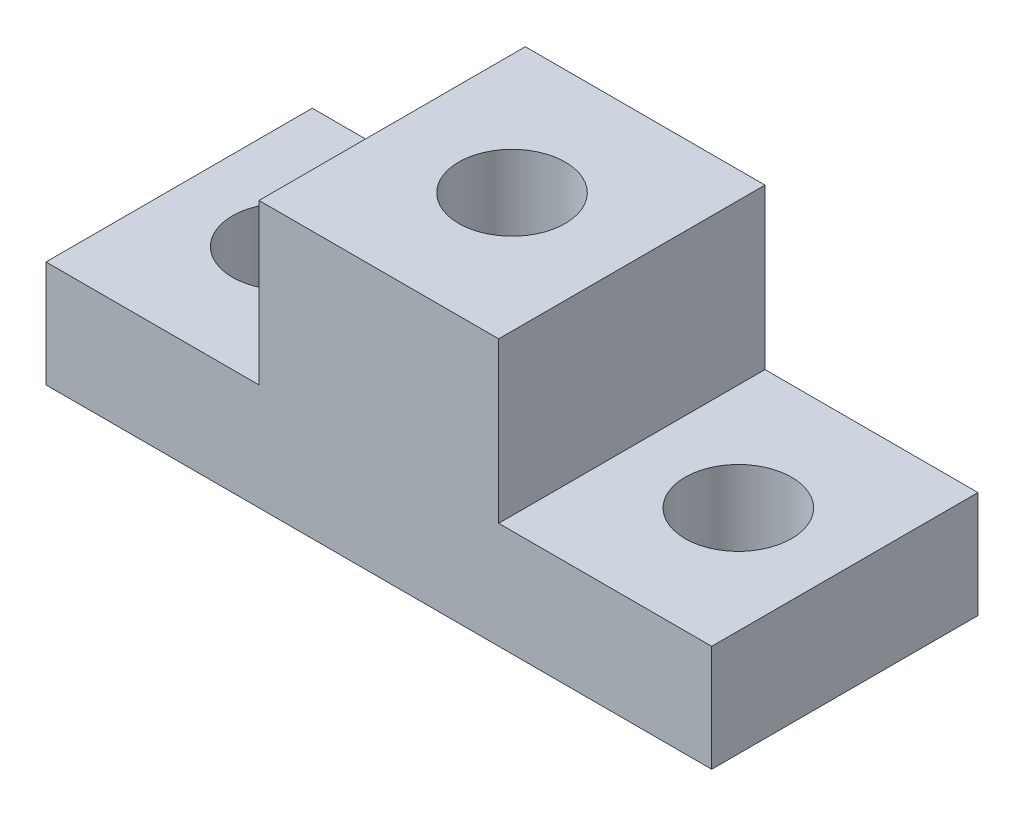
ISO-10303-21;
HEADER;
FILE_DESCRIPTION(('STEP AP214'),'2;1');
FILE_NAME('part.step','',(''),(''),'','','');
FILE_SCHEMA(('AUTOMOTIVE_DESIGN { 1 0 10303 214 1 1 1 1 }'));
ENDSEC;
DATA;
#1=APPLICATION_CONTEXT('core data for automotive mechanical design processes');
#2=APPLICATION_PROTOCOL_DEFINITION('international standard','automotive_design',2000,#1);
#3=PRODUCT_CONTEXT('',#1,'mechanical');
#4=PRODUCT('Part','Part','',(#3));
#5=PRODUCT_RELATED_PRODUCT_CATEGORY('part','',(#4));
#6=PRODUCT_DEFINITION_FORMATION('','',#4);
#7=PRODUCT_DEFINITION_CONTEXT('part definition',#1,'design');
#8=PRODUCT_DEFINITION('design','',#6,#7);
#9=PRODUCT_DEFINITION_SHAPE('','',#8);
#10=(LENGTH_UNIT() NAMED_UNIT(*) SI_UNIT(.MILLI.,.METRE.));
#11=(NAMED_UNIT(*) PLANE_ANGLE_UNIT() SI_UNIT($,.RADIAN.));
#12=(NAMED_UNIT(*) SI_UNIT($,.STERADIAN.) SOLID_ANGLE_UNIT());
#13=UNCERTAINTY_MEASURE_WITH_UNIT(LENGTH_MEASURE(1.E-05),#10,'distance_accuracy_value','');
#14=(GEOMETRIC_REPRESENTATION_CONTEXT(3) GLOBAL_UNCERTAINTY_ASSIGNED_CONTEXT((#13)) GLOBAL_UNIT_ASSIGNED_CONTEXT((#10,
#11,#12)) REPRESENTATION_CONTEXT('',''));
#15=CARTESIAN_POINT('',(0.,0.,0.));
#16=DIRECTION('',(0.,0.,1.));
#17=DIRECTION('',(1.,0.,0.));
#18=AXIS2_PLACEMENT_3D('',#15,#16,#17);
#19=CARTESIAN_POINT('',(12.5,10.,-5.));
#20=DIRECTION('',(-1.,0.,0.));
#21=DIRECTION('',(0.,0.,1.));
#22=AXIS2_PLACEMENT_3D('',#19,#20,#21);
#23=PLANE('',#22);
#24=DIRECTION('',(0.,-1.,0.));
#25=VECTOR('',#24,1.);
#26=CARTESIAN_POINT('',(12.5,10.,-5.));
#27=LINE('',#26,#25);
#28=CARTESIAN_POINT('',(12.5,4.,-5.));
#29=VERTEX_POINT('',#28);
#30=CARTESIAN_POINT('',(12.5,0.,-5.));
#31=VERTEX_POINT('',#30);
#32=EDGE_CURVE('E11',#29,#31,#27,.T.);
#33=ORIENTED_EDGE('',*,*,#32,.F.);
#34=DIRECTION('',(0.,0.,1.));
#35=VECTOR('',#34,1.);
#36=CARTESIAN_POINT('',(12.5,4.,-5.));
#37=LINE('',#36,#35);
#38=CARTESIAN_POINT('',(12.5,4.,5.));
#39=VERTEX_POINT('',#38);
#40=EDGE_CURVE('E102',#29,#39,#37,.T.);
#41=ORIENTED_EDGE('',*,*,#40,.T.);
#42=DIRECTION('',(0.,-1.,0.));
#43=VECTOR('',#42,1.);
#44=CARTESIAN_POINT('',(12.5,10.,5.));
#45=LINE('',#44,#43);
#46=CARTESIAN_POINT('',(12.5,0.,5.));
#47=VERTEX_POINT('',#46);
#48=EDGE_CURVE('E148',#39,#47,#45,.T.);
#49=ORIENTED_EDGE('',*,*,#48,.T.);
#50=DIRECTION('',(0.,0.,-1.));
#51=VECTOR('',#50,1.);
#52=CARTESIAN_POINT('',(12.5,0.,-5.));
#53=LINE('',#52,#51);
#54=EDGE_CURVE('E139',#47,#31,#53,.T.);
#55=ORIENTED_EDGE('',*,*,#54,.T.);
#56=EDGE_LOOP('',(#33,#41,#49,#55));
#57=FACE_BOUND('',#56,.T.);
#58=ADVANCED_FACE('F33',(#57),#23,.F.);
#59=CARTESIAN_POINT('',(-12.5,10.,-5.));
#60=DIRECTION('',(0.,0.,1.));
#61=DIRECTION('',(1.,0.,0.));
#62=AXIS2_PLACEMENT_3D('',#59,#60,#61);
#63=PLANE('',#62);
#64=DIRECTION('',(0.,-1.,0.));
#65=VECTOR('',#64,1.);
#66=CARTESIAN_POINT('',(4.5,4.,-5.));
#67=LINE('',#66,#65);
#68=CARTESIAN_POINT('',(4.5,10.,-5.));
#69=VERTEX_POINT('',#68);
#70=CARTESIAN_POINT('',(4.5,4.,-5.));
#71=VERTEX_POINT('',#70);
#72=EDGE_CURVE('E47',#69,#71,#67,.T.);
#73=ORIENTED_EDGE('',*,*,#72,.T.);
#74=DIRECTION('',(1.,0.,0.));
#75=VECTOR('',#74,1.);
#76=CARTESIAN_POINT('',(12.5,4.,-5.));
#77=LINE('',#76,#75);
#78=EDGE_CURVE('E106',#71,#29,#77,.T.);
#79=ORIENTED_EDGE('',*,*,#78,.T.);
#80=ORIENTED_EDGE('',*,*,#32,.T.);
#81=DIRECTION('',(-1.,0.,0.));
#82=VECTOR('',#81,1.);
#83=CARTESIAN_POINT('',(-12.5,0.,-5.));
#84=LINE('',#83,#82);
#85=CARTESIAN_POINT('',(-12.5,0.,-5.));
#86=VERTEX_POINT('',#85);
#87=EDGE_CURVE('E151',#31,#86,#84,.T.);
#88=ORIENTED_EDGE('',*,*,#87,.T.);
#89=DIRECTION('',(0.,-1.,0.));
#90=VECTOR('',#89,1.);
#91=CARTESIAN_POINT('',(-12.5,10.,-5.));
#92=LINE('',#91,#90);
#93=CARTESIAN_POINT('',(-12.5,4.,-5.));
#94=VERTEX_POINT('',#93);
#95=EDGE_CURVE('E40',#94,#86,#92,.T.);
#96=ORIENTED_EDGE('',*,*,#95,.F.);
#97=DIRECTION('',(1.,0.,0.));
#98=VECTOR('',#97,1.);
#99=CARTESIAN_POINT('',(-12.5,4.,-5.));
#100=LINE('',#99,#98);
#101=CARTESIAN_POINT('',(-4.5,4.,-5.));
#102=VERTEX_POINT('',#101);
#103=EDGE_CURVE('E128',#94,#102,#100,.T.);
#104=ORIENTED_EDGE('',*,*,#103,.T.);
#105=DIRECTION('',(0.,1.,0.));
#106=VECTOR('',#105,1.);
#107=CARTESIAN_POINT('',(-4.5,4.,-5.));
#108=LINE('',#107,#106);
#109=CARTESIAN_POINT('',(-4.5,10.,-5.));
#110=VERTEX_POINT('',#109);
#111=EDGE_CURVE('E131',#102,#110,#108,.T.);
#112=ORIENTED_EDGE('',*,*,#111,.T.);
#113=DIRECTION('',(-1.,0.,0.));
#114=VECTOR('',#113,1.);
#115=CARTESIAN_POINT('',(-12.5,10.,-5.));
#116=LINE('',#115,#114);
#117=EDGE_CURVE('E115',#69,#110,#116,.T.);
#118=ORIENTED_EDGE('',*,*,#117,.F.);
#119=EDGE_LOOP('',(#73,#79,#80,#88,#96,#104,#112,#118));
#120=FACE_BOUND('',#119,.T.);
#121=ADVANCED_FACE('F113',(#120),#63,.F.);
#122=CARTESIAN_POINT('',(-12.5,10.,-5.));
#123=DIRECTION('',(1.,0.,0.));
#124=DIRECTION('',(0.,0.,-1.));
#125=AXIS2_PLACEMENT_3D('',#122,#123,#124);
#126=PLANE('',#125);
#127=DIRECTION('',(0.,-1.,0.));
#128=VECTOR('',#127,1.);
#129=CARTESIAN_POINT('',(-12.5,10.,5.));
#130=LINE('',#129,#128);
#131=CARTESIAN_POINT('',(-12.5,4.,5.));
#132=VERTEX_POINT('',#131);
#133=CARTESIAN_POINT('',(-12.5,0.,5.));
#134=VERTEX_POINT('',#133);
#135=EDGE_CURVE('E160',#132,#134,#130,.T.);
#136=ORIENTED_EDGE('',*,*,#135,.F.);
#137=DIRECTION('',(0.,0.,1.));
#138=VECTOR('',#137,1.);
#139=CARTESIAN_POINT('',(-12.5,4.,-5.));
#140=LINE('',#139,#138);
#141=EDGE_CURVE('E133',#94,#132,#140,.T.);
#142=ORIENTED_EDGE('',*,*,#141,.F.);
#143=ORIENTED_EDGE('',*,*,#95,.T.);
#144=DIRECTION('',(0.,0.,1.));
#145=VECTOR('',#144,1.);
#146=CARTESIAN_POINT('',(-12.5,0.,-5.));
#147=LINE('',#146,#145);
#148=EDGE_CURVE('E154',#86,#134,#147,.T.);
#149=ORIENTED_EDGE('',*,*,#148,.T.);
#150=EDGE_LOOP('',(#136,#142,#143,#149));
#151=FACE_BOUND('',#150,.T.);
#152=ADVANCED_FACE('F165',(#151),#126,.F.);
#153=CARTESIAN_POINT('',(-12.5,10.,5.));
#154=DIRECTION('',(0.,0.,-1.));
#155=DIRECTION('',(-1.,0.,0.));
#156=AXIS2_PLACEMENT_3D('',#153,#154,#155);
#157=PLANE('',#156);
#158=ORIENTED_EDGE('',*,*,#48,.F.);
#159=DIRECTION('',(1.,0.,0.));
#160=VECTOR('',#159,1.);
#161=CARTESIAN_POINT('',(12.5,4.,5.));
#162=LINE('',#161,#160);
#163=CARTESIAN_POINT('',(4.5,4.,5.));
#164=VERTEX_POINT('',#163);
#165=EDGE_CURVE('E116',#164,#39,#162,.T.);
#166=ORIENTED_EDGE('',*,*,#165,.F.);
#167=DIRECTION('',(0.,-1.,0.));
#168=VECTOR('',#167,1.);
#169=CARTESIAN_POINT('',(4.5,4.,5.));
#170=LINE('',#169,#168);
#171=CARTESIAN_POINT('',(4.5,10.,5.));
#172=VERTEX_POINT('',#171);
#173=EDGE_CURVE('E99',#172,#164,#170,.T.);
#174=ORIENTED_EDGE('',*,*,#173,.F.);
#175=DIRECTION('',(1.,0.,0.));
#176=VECTOR('',#175,1.);
#177=CARTESIAN_POINT('',(-12.5,10.,5.));
#178=LINE('',#177,#176);
#179=CARTESIAN_POINT('',(-4.5,10.,5.));
#180=VERTEX_POINT('',#179);
#181=EDGE_CURVE('E144',#180,#172,#178,.T.);
#182=ORIENTED_EDGE('',*,*,#181,.F.);
#183=DIRECTION('',(0.,1.,0.));
#184=VECTOR('',#183,1.);
#185=CARTESIAN_POINT('',(-4.5,4.,5.));
#186=LINE('',#185,#184);
#187=CARTESIAN_POINT('',(-4.5,4.,5.));
#188=VERTEX_POINT('',#187);
#189=EDGE_CURVE('E55',#188,#180,#186,.T.);
#190=ORIENTED_EDGE('',*,*,#189,.F.);
#191=DIRECTION('',(1.,0.,0.));
#192=VECTOR('',#191,1.);
#193=CARTESIAN_POINT('',(-12.5,4.,5.));
#194=LINE('',#193,#192);
#195=EDGE_CURVE('E125',#132,#188,#194,.T.);
#196=ORIENTED_EDGE('',*,*,#195,.F.);
#197=ORIENTED_EDGE('',*,*,#135,.T.);
#198=DIRECTION('',(1.,0.,0.));
#199=VECTOR('',#198,1.);
#200=CARTESIAN_POINT('',(-12.5,0.,5.));
#201=LINE('',#200,#199);
#202=EDGE_CURVE('E145',#134,#47,#201,.T.);
#203=ORIENTED_EDGE('',*,*,#202,.T.);
#204=EDGE_LOOP('',(#158,#166,#174,#182,#190,#196,#197,#203));
#205=FACE_BOUND('',#204,.T.);
#206=ADVANCED_FACE('F174',(#205),#157,.F.);
#207=CARTESIAN_POINT('',(0.,10.,0.));
#208=DIRECTION('',(0.,1.,0.));
#209=DIRECTION('',(0.,0.,1.));
#210=AXIS2_PLACEMENT_3D('',#207,#208,#209);
#211=PLANE('',#210);
#212=CARTESIAN_POINT('',(0.,10.,0.));
#213=DIRECTION('',(0.,1.,0.));
#214=DIRECTION('',(0.,0.,1.));
#215=AXIS2_PLACEMENT_3D('',#212,#213,#214);
#216=CIRCLE('',#215,2.);
#217=CARTESIAN_POINT('',(0.,10.,2.));
#218=VERTEX_POINT('',#217);
#219=EDGE_CURVE('E120',#218,#218,#216,.T.);
#220=ORIENTED_EDGE('',*,*,#219,.F.);
#221=EDGE_LOOP('',(#220));
#222=FACE_BOUND('',#221,.T.);
#223=DIRECTION('',(0.,0.,1.));
#224=VECTOR('',#223,1.);
#225=CARTESIAN_POINT('',(4.5,10.,-5.));
#226=LINE('',#225,#224);
#227=EDGE_CURVE('E103',#69,#172,#226,.T.);
#228=ORIENTED_EDGE('',*,*,#227,.F.);
#229=ORIENTED_EDGE('',*,*,#117,.T.);
#230=DIRECTION('',(0.,0.,1.));
#231=VECTOR('',#230,1.);
#232=CARTESIAN_POINT('',(-4.5,10.,-5.));
#233=LINE('',#232,#231);
#234=EDGE_CURVE('E137',#110,#180,#233,.T.);
#235=ORIENTED_EDGE('',*,*,#234,.T.);
#236=ORIENTED_EDGE('',*,*,#181,.T.);
#237=EDGE_LOOP('',(#228,#229,#235,#236));
#238=FACE_BOUND('',#237,.T.);
#239=ADVANCED_FACE('F182',(#222,#238),#211,.T.);
#240=CARTESIAN_POINT('',(0.,0.,0.));
#241=DIRECTION('',(0.,1.,0.));
#242=DIRECTION('',(0.,0.,1.));
#243=AXIS2_PLACEMENT_3D('',#240,#241,#242);
#244=PLANE('',#243);
#245=CARTESIAN_POINT('',(8.5,0.,0.));
#246=DIRECTION('',(0.,1.,0.));
#247=DIRECTION('',(0.,0.,1.));
#248=AXIS2_PLACEMENT_3D('',#245,#246,#247);
#249=CIRCLE('',#248,2.);
#250=CARTESIAN_POINT('',(8.5,0.,2.));
#251=VERTEX_POINT('',#250);
#252=EDGE_CURVE('E230',#251,#251,#249,.T.);
#253=ORIENTED_EDGE('',*,*,#252,.T.);
#254=EDGE_LOOP('',(#253));
#255=FACE_BOUND('',#254,.T.);
#256=CARTESIAN_POINT('',(-8.5,0.,0.));
#257=DIRECTION('',(0.,1.,0.));
#258=DIRECTION('',(0.,0.,1.));
#259=AXIS2_PLACEMENT_3D('',#256,#257,#258);
#260=CIRCLE('',#259,2.);
#261=CARTESIAN_POINT('',(-8.5,0.,2.));
#262=VERTEX_POINT('',#261);
#263=EDGE_CURVE('E234',#262,#262,#260,.T.);
#264=ORIENTED_EDGE('',*,*,#263,.T.);
#265=EDGE_LOOP('',(#264));
#266=FACE_BOUND('',#265,.T.);
#267=CARTESIAN_POINT('',(0.,0.,0.));
#268=DIRECTION('',(0.,1.,0.));
#269=DIRECTION('',(0.,0.,1.));
#270=AXIS2_PLACEMENT_3D('',#267,#268,#269);
#271=CIRCLE('',#270,2.);
#272=CARTESIAN_POINT('',(0.,0.,2.));
#273=VERTEX_POINT('',#272);
#274=EDGE_CURVE('E123',#273,#273,#271,.T.);
#275=ORIENTED_EDGE('',*,*,#274,.T.);
#276=EDGE_LOOP('',(#275));
#277=FACE_BOUND('',#276,.T.);
#278=ORIENTED_EDGE('',*,*,#54,.F.);
#279=ORIENTED_EDGE('',*,*,#202,.F.);
#280=ORIENTED_EDGE('',*,*,#148,.F.);
#281=ORIENTED_EDGE('',*,*,#87,.F.);
#282=EDGE_LOOP('',(#278,#279,#280,#281));
#283=FACE_BOUND('',#282,.T.);
#284=ADVANCED_FACE('F171',(#255,#266,#277,#283),#244,.F.);
#285=CARTESIAN_POINT('',(-4.5,4.,-5.));
#286=DIRECTION('',(1.,0.,0.));
#287=DIRECTION('',(0.,0.,-1.));
#288=AXIS2_PLACEMENT_3D('',#285,#286,#287);
#289=PLANE('',#288);
#290=ORIENTED_EDGE('',*,*,#189,.T.);
#291=ORIENTED_EDGE('',*,*,#234,.F.);
#292=ORIENTED_EDGE('',*,*,#111,.F.);
#293=DIRECTION('',(0.,0.,1.));
#294=VECTOR('',#293,1.);
#295=CARTESIAN_POINT('',(-4.5,4.,-5.));
#296=LINE('',#295,#294);
#297=EDGE_CURVE('E140',#102,#188,#296,.T.);
#298=ORIENTED_EDGE('',*,*,#297,.T.);
#299=EDGE_LOOP('',(#290,#291,#292,#298));
#300=FACE_BOUND('',#299,.T.);
#301=ADVANCED_FACE('F180',(#300),#289,.F.);
#302=CARTESIAN_POINT('',(-12.5,4.,-5.));
#303=DIRECTION('',(0.,-1.,0.));
#304=DIRECTION('',(0.,0.,-1.));
#305=AXIS2_PLACEMENT_3D('',#302,#303,#304);
#306=PLANE('',#305);
#307=CARTESIAN_POINT('',(-8.5,4.,0.));
#308=DIRECTION('',(0.,1.,0.));
#309=DIRECTION('',(0.,0.,1.));
#310=AXIS2_PLACEMENT_3D('',#307,#308,#309);
#311=CIRCLE('',#310,2.);
#312=CARTESIAN_POINT('',(-8.5,4.,2.));
#313=VERTEX_POINT('',#312);
#314=EDGE_CURVE('E231',#313,#313,#311,.T.);
#315=ORIENTED_EDGE('',*,*,#314,.F.);
#316=EDGE_LOOP('',(#315));
#317=FACE_BOUND('',#316,.T.);
#318=ORIENTED_EDGE('',*,*,#195,.T.);
#319=ORIENTED_EDGE('',*,*,#297,.F.);
#320=ORIENTED_EDGE('',*,*,#103,.F.);
#321=ORIENTED_EDGE('',*,*,#141,.T.);
#322=EDGE_LOOP('',(#318,#319,#320,#321));
#323=FACE_BOUND('',#322,.T.);
#324=ADVANCED_FACE('F178',(#317,#323),#306,.F.);
#325=CARTESIAN_POINT('',(12.5,4.,-5.));
#326=DIRECTION('',(0.,-1.,0.));
#327=DIRECTION('',(0.,0.,-1.));
#328=AXIS2_PLACEMENT_3D('',#325,#326,#327);
#329=PLANE('',#328);
#330=CARTESIAN_POINT('',(8.5,4.,0.));
#331=DIRECTION('',(0.,1.,0.));
#332=DIRECTION('',(0.,0.,1.));
#333=AXIS2_PLACEMENT_3D('',#330,#331,#332);
#334=CIRCLE('',#333,2.);
#335=CARTESIAN_POINT('',(8.5,4.,2.));
#336=VERTEX_POINT('',#335);
#337=EDGE_CURVE('E227',#336,#336,#334,.T.);
#338=ORIENTED_EDGE('',*,*,#337,.F.);
#339=EDGE_LOOP('',(#338));
#340=FACE_BOUND('',#339,.T.);
#341=ORIENTED_EDGE('',*,*,#165,.T.);
#342=ORIENTED_EDGE('',*,*,#40,.F.);
#343=ORIENTED_EDGE('',*,*,#78,.F.);
#344=DIRECTION('',(0.,0.,1.));
#345=VECTOR('',#344,1.);
#346=CARTESIAN_POINT('',(4.5,4.,-5.));
#347=LINE('',#346,#345);
#348=EDGE_CURVE('E95',#71,#164,#347,.T.);
#349=ORIENTED_EDGE('',*,*,#348,.T.);
#350=EDGE_LOOP('',(#341,#342,#343,#349));
#351=FACE_BOUND('',#350,.T.);
#352=ADVANCED_FACE('F107',(#340,#351),#329,.F.);
#353=CARTESIAN_POINT('',(4.5,4.,-5.));
#354=DIRECTION('',(-1.,0.,0.));
#355=DIRECTION('',(0.,0.,1.));
#356=AXIS2_PLACEMENT_3D('',#353,#354,#355);
#357=PLANE('',#356);
#358=ORIENTED_EDGE('',*,*,#173,.T.);
#359=ORIENTED_EDGE('',*,*,#348,.F.);
#360=ORIENTED_EDGE('',*,*,#72,.F.);
#361=ORIENTED_EDGE('',*,*,#227,.T.);
#362=EDGE_LOOP('',(#358,#359,#360,#361));
#363=FACE_BOUND('',#362,.T.);
#364=ADVANCED_FACE('F97',(#363),#357,.F.);
#365=CARTESIAN_POINT('',(0.,0.,0.));
#366=DIRECTION('',(0.,1.,0.));
#367=DIRECTION('',(0.,0.,1.));
#368=AXIS2_PLACEMENT_3D('',#365,#366,#367);
#369=CYLINDRICAL_SURFACE('',#368,2.);
#370=ORIENTED_EDGE('',*,*,#274,.F.);
#371=EDGE_LOOP('',(#370));
#372=FACE_BOUND('',#371,.T.);
#373=ORIENTED_EDGE('',*,*,#219,.T.);
#374=EDGE_LOOP('',(#373));
#375=FACE_BOUND('',#374,.T.);
#376=ADVANCED_FACE('F208',(#372,#375),#369,.F.);
#377=CARTESIAN_POINT('',(-8.5,-6.,0.));
#378=DIRECTION('',(0.,1.,0.));
#379=DIRECTION('',(0.,0.,1.));
#380=AXIS2_PLACEMENT_3D('',#377,#378,#379);
#381=CYLINDRICAL_SURFACE('',#380,2.);
#382=ORIENTED_EDGE('',*,*,#314,.T.);
#383=EDGE_LOOP('',(#382));
#384=FACE_BOUND('',#383,.T.);
#385=ORIENTED_EDGE('',*,*,#263,.F.);
#386=EDGE_LOOP('',(#385));
#387=FACE_BOUND('',#386,.T.);
#388=ADVANCED_FACE('F214',(#384,#387),#381,.F.);
#389=CARTESIAN_POINT('',(8.5,-6.,0.));
#390=DIRECTION('',(0.,1.,0.));
#391=DIRECTION('',(0.,0.,1.));
#392=AXIS2_PLACEMENT_3D('',#389,#390,#391);
#393=CYLINDRICAL_SURFACE('',#392,2.);
#394=ORIENTED_EDGE('',*,*,#337,.T.);
#395=EDGE_LOOP('',(#394));
#396=FACE_BOUND('',#395,.T.);
#397=ORIENTED_EDGE('',*,*,#252,.F.);
#398=EDGE_LOOP('',(#397));
#399=FACE_BOUND('',#398,.T.);
#400=ADVANCED_FACE('F218',(#396,#399),#393,.F.);
#401=CLOSED_SHELL('',(#58,#121,#152,#206,#239,#284,#301,#324,#352,#364,#376,#388,#400));
#402=MANIFOLD_SOLID_BREP('B2',#401);
#403=ADVANCED_BREP_SHAPE_REPRESENTATION('',(#18,#402),#14);
#404=SHAPE_DEFINITION_REPRESENTATION(#9,#403);
ENDSEC;
END-ISO-10303-21;
